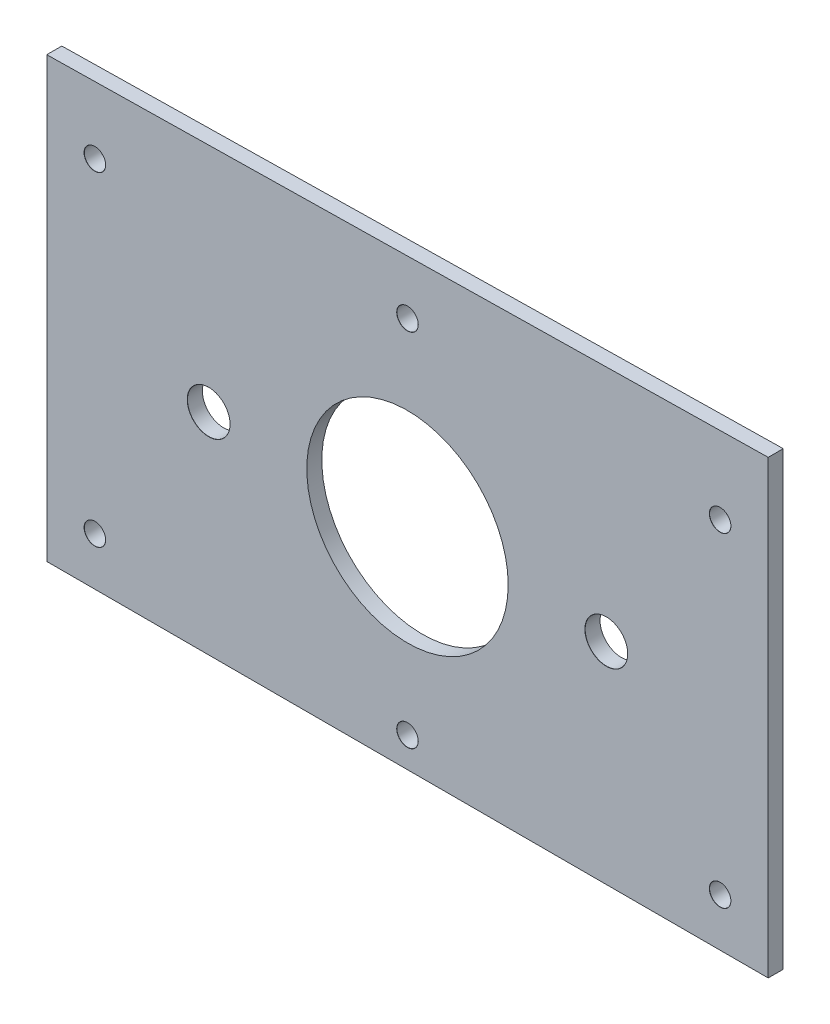
ISO-10303-21;
HEADER;
FILE_DESCRIPTION(('STEP AP214'),'2;1');
FILE_NAME('part.step','',(''),(''),'','','');
FILE_SCHEMA(('AUTOMOTIVE_DESIGN { 1 0 10303 214 1 1 1 1 }'));
ENDSEC;
DATA;
#1=APPLICATION_CONTEXT('core data for automotive mechanical design processes');
#2=APPLICATION_PROTOCOL_DEFINITION('international standard','automotive_design',2000,#1);
#3=PRODUCT_CONTEXT('',#1,'mechanical');
#4=PRODUCT('Part','Part','',(#3));
#5=PRODUCT_RELATED_PRODUCT_CATEGORY('part','',(#4));
#6=PRODUCT_DEFINITION_FORMATION('','',#4);
#7=PRODUCT_DEFINITION_CONTEXT('part definition',#1,'design');
#8=PRODUCT_DEFINITION('design','',#6,#7);
#9=PRODUCT_DEFINITION_SHAPE('','',#8);
#10=(LENGTH_UNIT() NAMED_UNIT(*) SI_UNIT(.MILLI.,.METRE.));
#11=(NAMED_UNIT(*) PLANE_ANGLE_UNIT() SI_UNIT($,.RADIAN.));
#12=(NAMED_UNIT(*) SI_UNIT($,.STERADIAN.) SOLID_ANGLE_UNIT());
#13=UNCERTAINTY_MEASURE_WITH_UNIT(LENGTH_MEASURE(1.E-05),#10,'distance_accuracy_value','');
#14=(GEOMETRIC_REPRESENTATION_CONTEXT(3) GLOBAL_UNCERTAINTY_ASSIGNED_CONTEXT((#13)) GLOBAL_UNIT_ASSIGNED_CONTEXT((#10,
#11,#12)) REPRESENTATION_CONTEXT('',''));
#15=CARTESIAN_POINT('',(0.,0.,0.));
#16=DIRECTION('',(0.,0.,1.));
#17=DIRECTION('',(1.,0.,0.));
#18=AXIS2_PLACEMENT_3D('',#15,#16,#17);
#19=CARTESIAN_POINT('',(76.2,44.45,3.175));
#20=DIRECTION('',(-1.,0.,0.));
#21=DIRECTION('',(0.,0.,1.));
#22=AXIS2_PLACEMENT_3D('',#19,#20,#21);
#23=PLANE('',#22);
#24=DIRECTION('',(0.,1.,0.));
#25=VECTOR('',#24,1.);
#26=CARTESIAN_POINT('',(76.2,44.45,0.));
#27=LINE('',#26,#25);
#28=CARTESIAN_POINT('',(76.2,-44.45,0.));
#29=VERTEX_POINT('',#28);
#30=CARTESIAN_POINT('',(76.2,50.8,0.));
#31=VERTEX_POINT('',#30);
#32=EDGE_CURVE('E80',#29,#31,#27,.T.);
#33=ORIENTED_EDGE('',*,*,#32,.T.);
#34=DIRECTION('',(0.,0.,-1.));
#35=VECTOR('',#34,1.);
#36=CARTESIAN_POINT('',(76.2,50.8,3.175));
#37=LINE('',#36,#35);
#38=CARTESIAN_POINT('',(76.2,50.8,3.175));
#39=VERTEX_POINT('',#38);
#40=EDGE_CURVE('E11',#39,#31,#37,.T.);
#41=ORIENTED_EDGE('',*,*,#40,.F.);
#42=DIRECTION('',(0.,1.,0.));
#43=VECTOR('',#42,1.);
#44=CARTESIAN_POINT('',(76.2,44.45,3.175));
#45=LINE('',#44,#43);
#46=CARTESIAN_POINT('',(76.2,-44.45,3.175));
#47=VERTEX_POINT('',#46);
#48=EDGE_CURVE('E85',#47,#39,#45,.T.);
#49=ORIENTED_EDGE('',*,*,#48,.F.);
#50=DIRECTION('',(0.,0.,-1.));
#51=VECTOR('',#50,1.);
#52=CARTESIAN_POINT('',(76.2,-44.45,3.175));
#53=LINE('',#52,#51);
#54=EDGE_CURVE('E101',#47,#29,#53,.T.);
#55=ORIENTED_EDGE('',*,*,#54,.T.);
#56=EDGE_LOOP('',(#33,#41,#49,#55));
#57=FACE_BOUND('',#56,.T.);
#58=ADVANCED_FACE('F41',(#57),#23,.F.);
#59=CARTESIAN_POINT('',(-76.2,48.26,3.175));
#60=DIRECTION('',(0.0166643523339933,-0.9998611400396,0.));
#61=DIRECTION('',(0.9998611400396,0.0166643523339933,0.));
#62=AXIS2_PLACEMENT_3D('',#59,#60,#61);
#63=PLANE('',#62);
#64=DIRECTION('',(-0.9998611400396,-0.0166643523339933,0.));
#65=VECTOR('',#64,1.);
#66=CARTESIAN_POINT('',(-76.2,48.26,0.));
#67=LINE('',#66,#65);
#68=CARTESIAN_POINT('',(-76.2,48.26,0.));
#69=VERTEX_POINT('',#68);
#70=EDGE_CURVE('E97',#31,#69,#67,.T.);
#71=ORIENTED_EDGE('',*,*,#70,.T.);
#72=DIRECTION('',(0.,0.,-1.));
#73=VECTOR('',#72,1.);
#74=CARTESIAN_POINT('',(-76.2,48.26,3.175));
#75=LINE('',#74,#73);
#76=CARTESIAN_POINT('',(-76.2,48.26,3.175));
#77=VERTEX_POINT('',#76);
#78=EDGE_CURVE('E49',#77,#69,#75,.T.);
#79=ORIENTED_EDGE('',*,*,#78,.F.);
#80=DIRECTION('',(-0.9998611400396,-0.0166643523339933,0.));
#81=VECTOR('',#80,1.);
#82=CARTESIAN_POINT('',(-76.2,48.26,3.175));
#83=LINE('',#82,#81);
#84=EDGE_CURVE('E88',#39,#77,#83,.T.);
#85=ORIENTED_EDGE('',*,*,#84,.F.);
#86=ORIENTED_EDGE('',*,*,#40,.T.);
#87=EDGE_LOOP('',(#71,#79,#85,#86));
#88=FACE_BOUND('',#87,.T.);
#89=ADVANCED_FACE('F96',(#88),#63,.F.);
#90=CARTESIAN_POINT('',(-76.2,44.45,3.175));
#91=DIRECTION('',(1.,0.,0.));
#92=DIRECTION('',(0.,0.,-1.));
#93=AXIS2_PLACEMENT_3D('',#90,#91,#92);
#94=PLANE('',#93);
#95=DIRECTION('',(0.,-1.,0.));
#96=VECTOR('',#95,1.);
#97=CARTESIAN_POINT('',(-76.2,44.45,0.));
#98=LINE('',#97,#96);
#99=CARTESIAN_POINT('',(-76.2,-44.45,0.));
#100=VERTEX_POINT('',#99);
#101=EDGE_CURVE('E73',#69,#100,#98,.T.);
#102=ORIENTED_EDGE('',*,*,#101,.T.);
#103=DIRECTION('',(0.,0.,-1.));
#104=VECTOR('',#103,1.);
#105=CARTESIAN_POINT('',(-76.2,-44.45,3.175));
#106=LINE('',#105,#104);
#107=CARTESIAN_POINT('',(-76.2,-44.45,3.175));
#108=VERTEX_POINT('',#107);
#109=EDGE_CURVE('E98',#108,#100,#106,.T.);
#110=ORIENTED_EDGE('',*,*,#109,.F.);
#111=DIRECTION('',(0.,-1.,0.));
#112=VECTOR('',#111,1.);
#113=CARTESIAN_POINT('',(-76.2,48.26,3.175));
#114=LINE('',#113,#112);
#115=EDGE_CURVE('E92',#77,#108,#114,.T.);
#116=ORIENTED_EDGE('',*,*,#115,.F.);
#117=ORIENTED_EDGE('',*,*,#78,.T.);
#118=EDGE_LOOP('',(#102,#110,#116,#117));
#119=FACE_BOUND('',#118,.T.);
#120=ADVANCED_FACE('F99',(#119),#94,.F.);
#121=CARTESIAN_POINT('',(-76.2,-44.45,3.175));
#122=DIRECTION('',(0.,1.,0.));
#123=DIRECTION('',(0.,0.,1.));
#124=AXIS2_PLACEMENT_3D('',#121,#122,#123);
#125=PLANE('',#124);
#126=DIRECTION('',(1.,0.,0.));
#127=VECTOR('',#126,1.);
#128=CARTESIAN_POINT('',(-76.2,-44.45,0.));
#129=LINE('',#128,#127);
#130=EDGE_CURVE('E109',#100,#29,#129,.T.);
#131=ORIENTED_EDGE('',*,*,#130,.T.);
#132=ORIENTED_EDGE('',*,*,#54,.F.);
#133=DIRECTION('',(1.,0.,0.));
#134=VECTOR('',#133,1.);
#135=CARTESIAN_POINT('',(-76.2,-44.45,3.175));
#136=LINE('',#135,#134);
#137=EDGE_CURVE('E57',#108,#47,#136,.T.);
#138=ORIENTED_EDGE('',*,*,#137,.F.);
#139=ORIENTED_EDGE('',*,*,#109,.T.);
#140=EDGE_LOOP('',(#131,#132,#138,#139));
#141=FACE_BOUND('',#140,.T.);
#142=ADVANCED_FACE('F114',(#141),#125,.F.);
#143=CARTESIAN_POINT('',(0.,0.,3.175));
#144=DIRECTION('',(0.,0.,1.));
#145=DIRECTION('',(1.,0.,0.));
#146=AXIS2_PLACEMENT_3D('',#143,#144,#145);
#147=PLANE('',#146);
#148=CARTESIAN_POINT('',(0.,0.,3.175));
#149=DIRECTION('',(0.,0.,1.));
#150=DIRECTION('',(1.,0.,0.));
#151=AXIS2_PLACEMENT_3D('',#148,#149,#150);
#152=CIRCLE('',#151,21.275);
#153=CARTESIAN_POINT('',(21.275,0.,3.175));
#154=VERTEX_POINT('',#153);
#155=EDGE_CURVE('E211',#154,#154,#152,.T.);
#156=ORIENTED_EDGE('',*,*,#155,.F.);
#157=EDGE_LOOP('',(#156));
#158=FACE_BOUND('',#157,.T.);
#159=CARTESIAN_POINT('',(-42.,0.,3.175));
#160=DIRECTION('',(0.,0.,1.));
#161=DIRECTION('',(1.,0.,0.));
#162=AXIS2_PLACEMENT_3D('',#159,#160,#161);
#163=CIRCLE('',#162,4.525);
#164=CARTESIAN_POINT('',(-37.475,0.,3.175));
#165=VERTEX_POINT('',#164);
#166=EDGE_CURVE('E207',#165,#165,#163,.T.);
#167=ORIENTED_EDGE('',*,*,#166,.F.);
#168=EDGE_LOOP('',(#167));
#169=FACE_BOUND('',#168,.T.);
#170=CARTESIAN_POINT('',(42.,0.,3.175));
#171=DIRECTION('',(0.,0.,1.));
#172=DIRECTION('',(1.,0.,0.));
#173=AXIS2_PLACEMENT_3D('',#170,#171,#172);
#174=CIRCLE('',#173,4.525);
#175=CARTESIAN_POINT('',(46.525,0.,3.175));
#176=VERTEX_POINT('',#175);
#177=EDGE_CURVE('E198',#176,#176,#174,.T.);
#178=ORIENTED_EDGE('',*,*,#177,.F.);
#179=EDGE_LOOP('',(#178));
#180=FACE_BOUND('',#179,.T.);
#181=CARTESIAN_POINT('',(-66.04,34.29,3.175));
#182=DIRECTION('',(0.,0.,1.));
#183=DIRECTION('',(1.,0.,0.));
#184=AXIS2_PLACEMENT_3D('',#181,#182,#183);
#185=CIRCLE('',#184,2.275);
#186=CARTESIAN_POINT('',(-63.765,34.29,3.175));
#187=VERTEX_POINT('',#186);
#188=EDGE_CURVE('E189',#187,#187,#185,.T.);
#189=ORIENTED_EDGE('',*,*,#188,.F.);
#190=EDGE_LOOP('',(#189));
#191=FACE_BOUND('',#190,.T.);
#192=CARTESIAN_POINT('',(-66.04,-34.29,3.175));
#193=DIRECTION('',(0.,0.,1.));
#194=DIRECTION('',(1.,0.,0.));
#195=AXIS2_PLACEMENT_3D('',#192,#193,#194);
#196=CIRCLE('',#195,2.275);
#197=CARTESIAN_POINT('',(-63.765,-34.29,3.175));
#198=VERTEX_POINT('',#197);
#199=EDGE_CURVE('E180',#198,#198,#196,.T.);
#200=ORIENTED_EDGE('',*,*,#199,.F.);
#201=EDGE_LOOP('',(#200));
#202=FACE_BOUND('',#201,.T.);
#203=CARTESIAN_POINT('',(0.,-38.1,3.175));
#204=DIRECTION('',(0.,0.,1.));
#205=DIRECTION('',(1.,0.,0.));
#206=AXIS2_PLACEMENT_3D('',#203,#204,#205);
#207=CIRCLE('',#206,2.275);
#208=CARTESIAN_POINT('',(2.27500000000003,-38.1,3.175));
#209=VERTEX_POINT('',#208);
#210=EDGE_CURVE('E171',#209,#209,#207,.T.);
#211=ORIENTED_EDGE('',*,*,#210,.F.);
#212=EDGE_LOOP('',(#211));
#213=FACE_BOUND('',#212,.T.);
#214=CARTESIAN_POINT('',(66.04,-34.29,3.175));
#215=DIRECTION('',(0.,0.,1.));
#216=DIRECTION('',(1.,0.,0.));
#217=AXIS2_PLACEMENT_3D('',#214,#215,#216);
#218=CIRCLE('',#217,2.275);
#219=CARTESIAN_POINT('',(68.315,-34.29,3.175));
#220=VERTEX_POINT('',#219);
#221=EDGE_CURVE('E162',#220,#220,#218,.T.);
#222=ORIENTED_EDGE('',*,*,#221,.F.);
#223=EDGE_LOOP('',(#222));
#224=FACE_BOUND('',#223,.T.);
#225=CARTESIAN_POINT('',(66.04,34.29,3.175));
#226=DIRECTION('',(0.,0.,1.));
#227=DIRECTION('',(1.,0.,0.));
#228=AXIS2_PLACEMENT_3D('',#225,#226,#227);
#229=CIRCLE('',#228,2.275);
#230=CARTESIAN_POINT('',(68.315,34.29,3.175));
#231=VERTEX_POINT('',#230);
#232=EDGE_CURVE('E153',#231,#231,#229,.T.);
#233=ORIENTED_EDGE('',*,*,#232,.F.);
#234=EDGE_LOOP('',(#233));
#235=FACE_BOUND('',#234,.T.);
#236=CARTESIAN_POINT('',(0.,38.1,3.175));
#237=DIRECTION('',(0.,0.,1.));
#238=DIRECTION('',(1.,0.,0.));
#239=AXIS2_PLACEMENT_3D('',#236,#237,#238);
#240=CIRCLE('',#239,2.275);
#241=CARTESIAN_POINT('',(2.27500000000003,38.1,3.175));
#242=VERTEX_POINT('',#241);
#243=EDGE_CURVE('E144',#242,#242,#240,.T.);
#244=ORIENTED_EDGE('',*,*,#243,.F.);
#245=EDGE_LOOP('',(#244));
#246=FACE_BOUND('',#245,.T.);
#247=ORIENTED_EDGE('',*,*,#48,.T.);
#248=ORIENTED_EDGE('',*,*,#84,.T.);
#249=ORIENTED_EDGE('',*,*,#115,.T.);
#250=ORIENTED_EDGE('',*,*,#137,.T.);
#251=EDGE_LOOP('',(#247,#248,#249,#250));
#252=FACE_BOUND('',#251,.T.);
#253=ADVANCED_FACE('F90',(#158,#169,#180,#191,#202,#213,#224,#235,#246,#252),#147,.T.);
#254=CARTESIAN_POINT('',(0.,0.,0.));
#255=DIRECTION('',(0.,0.,1.));
#256=DIRECTION('',(1.,0.,0.));
#257=AXIS2_PLACEMENT_3D('',#254,#255,#256);
#258=PLANE('',#257);
#259=CARTESIAN_POINT('',(0.,0.,0.));
#260=DIRECTION('',(0.,0.,1.));
#261=DIRECTION('',(1.,0.,0.));
#262=AXIS2_PLACEMENT_3D('',#259,#260,#261);
#263=CIRCLE('',#262,21.275);
#264=CARTESIAN_POINT('',(21.275,0.,0.));
#265=VERTEX_POINT('',#264);
#266=EDGE_CURVE('E210',#265,#265,#263,.T.);
#267=ORIENTED_EDGE('',*,*,#266,.T.);
#268=EDGE_LOOP('',(#267));
#269=FACE_BOUND('',#268,.T.);
#270=CARTESIAN_POINT('',(-42.,0.,0.));
#271=DIRECTION('',(0.,0.,1.));
#272=DIRECTION('',(1.,0.,0.));
#273=AXIS2_PLACEMENT_3D('',#270,#271,#272);
#274=CIRCLE('',#273,4.5);
#275=CARTESIAN_POINT('',(-37.5,0.,0.));
#276=VERTEX_POINT('',#275);
#277=EDGE_CURVE('E201',#276,#276,#274,.T.);
#278=ORIENTED_EDGE('',*,*,#277,.T.);
#279=EDGE_LOOP('',(#278));
#280=FACE_BOUND('',#279,.T.);
#281=CARTESIAN_POINT('',(42.,0.,0.));
#282=DIRECTION('',(0.,0.,1.));
#283=DIRECTION('',(1.,0.,0.));
#284=AXIS2_PLACEMENT_3D('',#281,#282,#283);
#285=CIRCLE('',#284,4.5);
#286=CARTESIAN_POINT('',(46.5,0.,0.));
#287=VERTEX_POINT('',#286);
#288=EDGE_CURVE('E192',#287,#287,#285,.T.);
#289=ORIENTED_EDGE('',*,*,#288,.T.);
#290=EDGE_LOOP('',(#289));
#291=FACE_BOUND('',#290,.T.);
#292=CARTESIAN_POINT('',(-66.04,34.29,0.));
#293=DIRECTION('',(0.,0.,1.));
#294=DIRECTION('',(1.,0.,0.));
#295=AXIS2_PLACEMENT_3D('',#292,#293,#294);
#296=CIRCLE('',#295,2.25);
#297=CARTESIAN_POINT('',(-63.79,34.29,0.));
#298=VERTEX_POINT('',#297);
#299=EDGE_CURVE('E183',#298,#298,#296,.T.);
#300=ORIENTED_EDGE('',*,*,#299,.T.);
#301=EDGE_LOOP('',(#300));
#302=FACE_BOUND('',#301,.T.);
#303=CARTESIAN_POINT('',(-66.04,-34.29,0.));
#304=DIRECTION('',(0.,0.,1.));
#305=DIRECTION('',(1.,0.,0.));
#306=AXIS2_PLACEMENT_3D('',#303,#304,#305);
#307=CIRCLE('',#306,2.25);
#308=CARTESIAN_POINT('',(-63.79,-34.29,0.));
#309=VERTEX_POINT('',#308);
#310=EDGE_CURVE('E174',#309,#309,#307,.T.);
#311=ORIENTED_EDGE('',*,*,#310,.T.);
#312=EDGE_LOOP('',(#311));
#313=FACE_BOUND('',#312,.T.);
#314=CARTESIAN_POINT('',(0.,-38.1,0.));
#315=DIRECTION('',(0.,0.,1.));
#316=DIRECTION('',(1.,0.,0.));
#317=AXIS2_PLACEMENT_3D('',#314,#315,#316);
#318=CIRCLE('',#317,2.25);
#319=CARTESIAN_POINT('',(2.25000000000003,-38.1,0.));
#320=VERTEX_POINT('',#319);
#321=EDGE_CURVE('E165',#320,#320,#318,.T.);
#322=ORIENTED_EDGE('',*,*,#321,.T.);
#323=EDGE_LOOP('',(#322));
#324=FACE_BOUND('',#323,.T.);
#325=CARTESIAN_POINT('',(66.04,-34.29,0.));
#326=DIRECTION('',(0.,0.,1.));
#327=DIRECTION('',(1.,0.,0.));
#328=AXIS2_PLACEMENT_3D('',#325,#326,#327);
#329=CIRCLE('',#328,2.25);
#330=CARTESIAN_POINT('',(68.29,-34.29,0.));
#331=VERTEX_POINT('',#330);
#332=EDGE_CURVE('E156',#331,#331,#329,.T.);
#333=ORIENTED_EDGE('',*,*,#332,.T.);
#334=EDGE_LOOP('',(#333));
#335=FACE_BOUND('',#334,.T.);
#336=CARTESIAN_POINT('',(66.04,34.29,0.));
#337=DIRECTION('',(0.,0.,1.));
#338=DIRECTION('',(1.,0.,0.));
#339=AXIS2_PLACEMENT_3D('',#336,#337,#338);
#340=CIRCLE('',#339,2.25);
#341=CARTESIAN_POINT('',(68.29,34.29,0.));
#342=VERTEX_POINT('',#341);
#343=EDGE_CURVE('E147',#342,#342,#340,.T.);
#344=ORIENTED_EDGE('',*,*,#343,.T.);
#345=EDGE_LOOP('',(#344));
#346=FACE_BOUND('',#345,.T.);
#347=CARTESIAN_POINT('',(0.,38.1,0.));
#348=DIRECTION('',(0.,0.,1.));
#349=DIRECTION('',(1.,0.,0.));
#350=AXIS2_PLACEMENT_3D('',#347,#348,#349);
#351=CIRCLE('',#350,2.25);
#352=CARTESIAN_POINT('',(2.25000000000003,38.1,0.));
#353=VERTEX_POINT('',#352);
#354=EDGE_CURVE('E106',#353,#353,#351,.T.);
#355=ORIENTED_EDGE('',*,*,#354,.T.);
#356=EDGE_LOOP('',(#355));
#357=FACE_BOUND('',#356,.T.);
#358=ORIENTED_EDGE('',*,*,#32,.F.);
#359=ORIENTED_EDGE('',*,*,#130,.F.);
#360=ORIENTED_EDGE('',*,*,#101,.F.);
#361=ORIENTED_EDGE('',*,*,#70,.F.);
#362=EDGE_LOOP('',(#358,#359,#360,#361));
#363=FACE_BOUND('',#362,.T.);
#364=ADVANCED_FACE('F115',(#269,#280,#291,#302,#313,#324,#335,#346,#357,#363),#258,.F.);
#365=CARTESIAN_POINT('',(0.,38.1,3.175));
#366=DIRECTION('',(0.,0.,1.));
#367=DIRECTION('',(1.,0.,0.));
#368=AXIS2_PLACEMENT_3D('',#365,#366,#367);
#369=CYLINDRICAL_SURFACE('',#368,2.25);
#370=ORIENTED_EDGE('',*,*,#354,.F.);
#371=EDGE_LOOP('',(#370));
#372=FACE_BOUND('',#371,.T.);
#373=CARTESIAN_POINT('',(0.,38.1,3.15));
#374=DIRECTION('',(0.,0.,1.));
#375=DIRECTION('',(1.,0.,0.));
#376=AXIS2_PLACEMENT_3D('',#373,#374,#375);
#377=CIRCLE('',#376,2.25);
#378=CARTESIAN_POINT('',(2.25000000000003,38.1,3.15));
#379=VERTEX_POINT('',#378);
#380=EDGE_CURVE('E141',#379,#379,#377,.T.);
#381=ORIENTED_EDGE('',*,*,#380,.T.);
#382=EDGE_LOOP('',(#381));
#383=FACE_BOUND('',#382,.T.);
#384=ADVANCED_FACE('F117',(#372,#383),#369,.F.);
#385=CARTESIAN_POINT('',(0.,38.1,3.175));
#386=DIRECTION('',(0.,0.,1.));
#387=DIRECTION('',(1.,0.,0.));
#388=AXIS2_PLACEMENT_3D('',#385,#386,#387);
#389=CONICAL_SURFACE('',#388,2.275,0.785398163397396);
#390=ORIENTED_EDGE('',*,*,#380,.F.);
#391=EDGE_LOOP('',(#390));
#392=FACE_BOUND('',#391,.T.);
#393=ORIENTED_EDGE('',*,*,#243,.T.);
#394=EDGE_LOOP('',(#393));
#395=FACE_BOUND('',#394,.T.);
#396=ADVANCED_FACE('F125',(#392,#395),#389,.F.);
#397=CARTESIAN_POINT('',(66.04,34.29,3.175));
#398=DIRECTION('',(0.,0.,1.));
#399=DIRECTION('',(1.,0.,0.));
#400=AXIS2_PLACEMENT_3D('',#397,#398,#399);
#401=CYLINDRICAL_SURFACE('',#400,2.25);
#402=ORIENTED_EDGE('',*,*,#343,.F.);
#403=EDGE_LOOP('',(#402));
#404=FACE_BOUND('',#403,.T.);
#405=CARTESIAN_POINT('',(66.04,34.29,3.15));
#406=DIRECTION('',(0.,0.,1.));
#407=DIRECTION('',(1.,0.,0.));
#408=AXIS2_PLACEMENT_3D('',#405,#406,#407);
#409=CIRCLE('',#408,2.25);
#410=CARTESIAN_POINT('',(68.29,34.29,3.15));
#411=VERTEX_POINT('',#410);
#412=EDGE_CURVE('E150',#411,#411,#409,.T.);
#413=ORIENTED_EDGE('',*,*,#412,.T.);
#414=EDGE_LOOP('',(#413));
#415=FACE_BOUND('',#414,.T.);
#416=ADVANCED_FACE('F239',(#404,#415),#401,.F.);
#417=CARTESIAN_POINT('',(66.04,34.29,3.175));
#418=DIRECTION('',(0.,0.,1.));
#419=DIRECTION('',(1.,0.,0.));
#420=AXIS2_PLACEMENT_3D('',#417,#418,#419);
#421=CONICAL_SURFACE('',#420,2.275,0.785398163397353);
#422=ORIENTED_EDGE('',*,*,#412,.F.);
#423=EDGE_LOOP('',(#422));
#424=FACE_BOUND('',#423,.T.);
#425=ORIENTED_EDGE('',*,*,#232,.T.);
#426=EDGE_LOOP('',(#425));
#427=FACE_BOUND('',#426,.T.);
#428=ADVANCED_FACE('F245',(#424,#427),#421,.F.);
#429=CARTESIAN_POINT('',(66.04,-34.29,3.175));
#430=DIRECTION('',(0.,0.,1.));
#431=DIRECTION('',(1.,0.,0.));
#432=AXIS2_PLACEMENT_3D('',#429,#430,#431);
#433=CYLINDRICAL_SURFACE('',#432,2.25);
#434=ORIENTED_EDGE('',*,*,#332,.F.);
#435=EDGE_LOOP('',(#434));
#436=FACE_BOUND('',#435,.T.);
#437=CARTESIAN_POINT('',(66.04,-34.29,3.15));
#438=DIRECTION('',(0.,0.,1.));
#439=DIRECTION('',(1.,0.,0.));
#440=AXIS2_PLACEMENT_3D('',#437,#438,#439);
#441=CIRCLE('',#440,2.25);
#442=CARTESIAN_POINT('',(68.29,-34.29,3.15));
#443=VERTEX_POINT('',#442);
#444=EDGE_CURVE('E159',#443,#443,#441,.T.);
#445=ORIENTED_EDGE('',*,*,#444,.T.);
#446=EDGE_LOOP('',(#445));
#447=FACE_BOUND('',#446,.T.);
#448=ADVANCED_FACE('F252',(#436,#447),#433,.F.);
#449=CARTESIAN_POINT('',(66.04,-34.29,3.175));
#450=DIRECTION('',(0.,0.,1.));
#451=DIRECTION('',(1.,0.,0.));
#452=AXIS2_PLACEMENT_3D('',#449,#450,#451);
#453=CONICAL_SURFACE('',#452,2.275,0.785398163397353);
#454=ORIENTED_EDGE('',*,*,#444,.F.);
#455=EDGE_LOOP('',(#454));
#456=FACE_BOUND('',#455,.T.);
#457=ORIENTED_EDGE('',*,*,#221,.T.);
#458=EDGE_LOOP('',(#457));
#459=FACE_BOUND('',#458,.T.);
#460=ADVANCED_FACE('F256',(#456,#459),#453,.F.);
#461=CARTESIAN_POINT('',(0.,-38.1,3.175));
#462=DIRECTION('',(0.,0.,1.));
#463=DIRECTION('',(1.,0.,0.));
#464=AXIS2_PLACEMENT_3D('',#461,#462,#463);
#465=CYLINDRICAL_SURFACE('',#464,2.25);
#466=ORIENTED_EDGE('',*,*,#321,.F.);
#467=EDGE_LOOP('',(#466));
#468=FACE_BOUND('',#467,.T.);
#469=CARTESIAN_POINT('',(0.,-38.1,3.15));
#470=DIRECTION('',(0.,0.,1.));
#471=DIRECTION('',(1.,0.,0.));
#472=AXIS2_PLACEMENT_3D('',#469,#470,#471);
#473=CIRCLE('',#472,2.25);
#474=CARTESIAN_POINT('',(2.25000000000003,-38.1,3.15));
#475=VERTEX_POINT('',#474);
#476=EDGE_CURVE('E168',#475,#475,#473,.T.);
#477=ORIENTED_EDGE('',*,*,#476,.T.);
#478=EDGE_LOOP('',(#477));
#479=FACE_BOUND('',#478,.T.);
#480=ADVANCED_FACE('F260',(#468,#479),#465,.F.);
#481=CARTESIAN_POINT('',(0.,-38.1,3.175));
#482=DIRECTION('',(0.,0.,1.));
#483=DIRECTION('',(1.,0.,0.));
#484=AXIS2_PLACEMENT_3D('',#481,#482,#483);
#485=CONICAL_SURFACE('',#484,2.275,0.785398163397396);
#486=ORIENTED_EDGE('',*,*,#476,.F.);
#487=EDGE_LOOP('',(#486));
#488=FACE_BOUND('',#487,.T.);
#489=ORIENTED_EDGE('',*,*,#210,.T.);
#490=EDGE_LOOP('',(#489));
#491=FACE_BOUND('',#490,.T.);
#492=ADVANCED_FACE('F264',(#488,#491),#485,.F.);
#493=CARTESIAN_POINT('',(-66.04,-34.29,3.175));
#494=DIRECTION('',(0.,0.,1.));
#495=DIRECTION('',(1.,0.,0.));
#496=AXIS2_PLACEMENT_3D('',#493,#494,#495);
#497=CYLINDRICAL_SURFACE('',#496,2.25);
#498=ORIENTED_EDGE('',*,*,#310,.F.);
#499=EDGE_LOOP('',(#498));
#500=FACE_BOUND('',#499,.T.);
#501=CARTESIAN_POINT('',(-66.04,-34.29,3.15));
#502=DIRECTION('',(0.,0.,1.));
#503=DIRECTION('',(1.,0.,0.));
#504=AXIS2_PLACEMENT_3D('',#501,#502,#503);
#505=CIRCLE('',#504,2.25);
#506=CARTESIAN_POINT('',(-63.79,-34.29,3.15));
#507=VERTEX_POINT('',#506);
#508=EDGE_CURVE('E177',#507,#507,#505,.T.);
#509=ORIENTED_EDGE('',*,*,#508,.T.);
#510=EDGE_LOOP('',(#509));
#511=FACE_BOUND('',#510,.T.);
#512=ADVANCED_FACE('F268',(#500,#511),#497,.F.);
#513=CARTESIAN_POINT('',(-66.04,-34.29,3.175));
#514=DIRECTION('',(0.,0.,1.));
#515=DIRECTION('',(1.,0.,0.));
#516=AXIS2_PLACEMENT_3D('',#513,#514,#515);
#517=CONICAL_SURFACE('',#516,2.275,0.785398163397353);
#518=ORIENTED_EDGE('',*,*,#508,.F.);
#519=EDGE_LOOP('',(#518));
#520=FACE_BOUND('',#519,.T.);
#521=ORIENTED_EDGE('',*,*,#199,.T.);
#522=EDGE_LOOP('',(#521));
#523=FACE_BOUND('',#522,.T.);
#524=ADVANCED_FACE('F272',(#520,#523),#517,.F.);
#525=CARTESIAN_POINT('',(-66.04,34.29,3.175));
#526=DIRECTION('',(0.,0.,1.));
#527=DIRECTION('',(1.,0.,0.));
#528=AXIS2_PLACEMENT_3D('',#525,#526,#527);
#529=CYLINDRICAL_SURFACE('',#528,2.25);
#530=ORIENTED_EDGE('',*,*,#299,.F.);
#531=EDGE_LOOP('',(#530));
#532=FACE_BOUND('',#531,.T.);
#533=CARTESIAN_POINT('',(-66.04,34.29,3.15));
#534=DIRECTION('',(0.,0.,1.));
#535=DIRECTION('',(1.,0.,0.));
#536=AXIS2_PLACEMENT_3D('',#533,#534,#535);
#537=CIRCLE('',#536,2.25);
#538=CARTESIAN_POINT('',(-63.79,34.29,3.15));
#539=VERTEX_POINT('',#538);
#540=EDGE_CURVE('E186',#539,#539,#537,.T.);
#541=ORIENTED_EDGE('',*,*,#540,.T.);
#542=EDGE_LOOP('',(#541));
#543=FACE_BOUND('',#542,.T.);
#544=ADVANCED_FACE('F276',(#532,#543),#529,.F.);
#545=CARTESIAN_POINT('',(-66.04,34.29,3.175));
#546=DIRECTION('',(0.,0.,1.));
#547=DIRECTION('',(1.,0.,0.));
#548=AXIS2_PLACEMENT_3D('',#545,#546,#547);
#549=CONICAL_SURFACE('',#548,2.275,0.785398163397353);
#550=ORIENTED_EDGE('',*,*,#540,.F.);
#551=EDGE_LOOP('',(#550));
#552=FACE_BOUND('',#551,.T.);
#553=ORIENTED_EDGE('',*,*,#188,.T.);
#554=EDGE_LOOP('',(#553));
#555=FACE_BOUND('',#554,.T.);
#556=ADVANCED_FACE('F280',(#552,#555),#549,.F.);
#557=CARTESIAN_POINT('',(42.,0.,3.175));
#558=DIRECTION('',(0.,0.,1.));
#559=DIRECTION('',(1.,0.,0.));
#560=AXIS2_PLACEMENT_3D('',#557,#558,#559);
#561=CYLINDRICAL_SURFACE('',#560,4.5);
#562=ORIENTED_EDGE('',*,*,#288,.F.);
#563=EDGE_LOOP('',(#562));
#564=FACE_BOUND('',#563,.T.);
#565=CARTESIAN_POINT('',(42.,0.,3.15));
#566=DIRECTION('',(0.,0.,1.));
#567=DIRECTION('',(1.,0.,0.));
#568=AXIS2_PLACEMENT_3D('',#565,#566,#567);
#569=CIRCLE('',#568,4.5);
#570=CARTESIAN_POINT('',(46.5,0.,3.15));
#571=VERTEX_POINT('',#570);
#572=EDGE_CURVE('E195',#571,#571,#569,.T.);
#573=ORIENTED_EDGE('',*,*,#572,.T.);
#574=EDGE_LOOP('',(#573));
#575=FACE_BOUND('',#574,.T.);
#576=ADVANCED_FACE('F284',(#564,#575),#561,.F.);
#577=CARTESIAN_POINT('',(42.,0.,3.175));
#578=DIRECTION('',(0.,0.,1.));
#579=DIRECTION('',(1.,0.,0.));
#580=AXIS2_PLACEMENT_3D('',#577,#578,#579);
#581=CONICAL_SURFACE('',#580,4.525,0.7853981633975);
#582=ORIENTED_EDGE('',*,*,#572,.F.);
#583=EDGE_LOOP('',(#582));
#584=FACE_BOUND('',#583,.T.);
#585=ORIENTED_EDGE('',*,*,#177,.T.);
#586=EDGE_LOOP('',(#585));
#587=FACE_BOUND('',#586,.T.);
#588=ADVANCED_FACE('F288',(#584,#587),#581,.F.);
#589=CARTESIAN_POINT('',(-42.,0.,3.175));
#590=DIRECTION('',(0.,0.,1.));
#591=DIRECTION('',(1.,0.,0.));
#592=AXIS2_PLACEMENT_3D('',#589,#590,#591);
#593=CYLINDRICAL_SURFACE('',#592,4.5);
#594=ORIENTED_EDGE('',*,*,#277,.F.);
#595=EDGE_LOOP('',(#594));
#596=FACE_BOUND('',#595,.T.);
#597=CARTESIAN_POINT('',(-42.,0.,3.15));
#598=DIRECTION('',(0.,0.,1.));
#599=DIRECTION('',(1.,0.,0.));
#600=AXIS2_PLACEMENT_3D('',#597,#598,#599);
#601=CIRCLE('',#600,4.5);
#602=CARTESIAN_POINT('',(-37.5,0.,3.15));
#603=VERTEX_POINT('',#602);
#604=EDGE_CURVE('E204',#603,#603,#601,.T.);
#605=ORIENTED_EDGE('',*,*,#604,.T.);
#606=EDGE_LOOP('',(#605));
#607=FACE_BOUND('',#606,.T.);
#608=ADVANCED_FACE('F292',(#596,#607),#593,.F.);
#609=CARTESIAN_POINT('',(-42.,0.,3.175));
#610=DIRECTION('',(0.,0.,1.));
#611=DIRECTION('',(1.,0.,0.));
#612=AXIS2_PLACEMENT_3D('',#609,#610,#611);
#613=CONICAL_SURFACE('',#612,4.525,0.7853981633975);
#614=ORIENTED_EDGE('',*,*,#604,.F.);
#615=EDGE_LOOP('',(#614));
#616=FACE_BOUND('',#615,.T.);
#617=ORIENTED_EDGE('',*,*,#166,.T.);
#618=EDGE_LOOP('',(#617));
#619=FACE_BOUND('',#618,.T.);
#620=ADVANCED_FACE('F218',(#616,#619),#613,.F.);
#621=CARTESIAN_POINT('',(0.,0.,0.));
#622=DIRECTION('',(0.,0.,1.));
#623=DIRECTION('',(1.,0.,0.));
#624=AXIS2_PLACEMENT_3D('',#621,#622,#623);
#625=CYLINDRICAL_SURFACE('',#624,21.275);
#626=ORIENTED_EDGE('',*,*,#266,.F.);
#627=EDGE_LOOP('',(#626));
#628=FACE_BOUND('',#627,.T.);
#629=ORIENTED_EDGE('',*,*,#155,.T.);
#630=EDGE_LOOP('',(#629));
#631=FACE_BOUND('',#630,.T.);
#632=ADVANCED_FACE('F216',(#628,#631),#625,.F.);
#633=CLOSED_SHELL('',(#58,#89,#120,#142,#253,#364,#384,#396,#416,#428,#448,#460,#480,#492,#512,
#524,#544,#556,#576,#588,#608,#620,#632));
#634=MANIFOLD_SOLID_BREP('B2',#633);
#635=ADVANCED_BREP_SHAPE_REPRESENTATION('',(#18,#634),#14);
#636=SHAPE_DEFINITION_REPRESENTATION(#9,#635);
ENDSEC;
END-ISO-10303-21;
